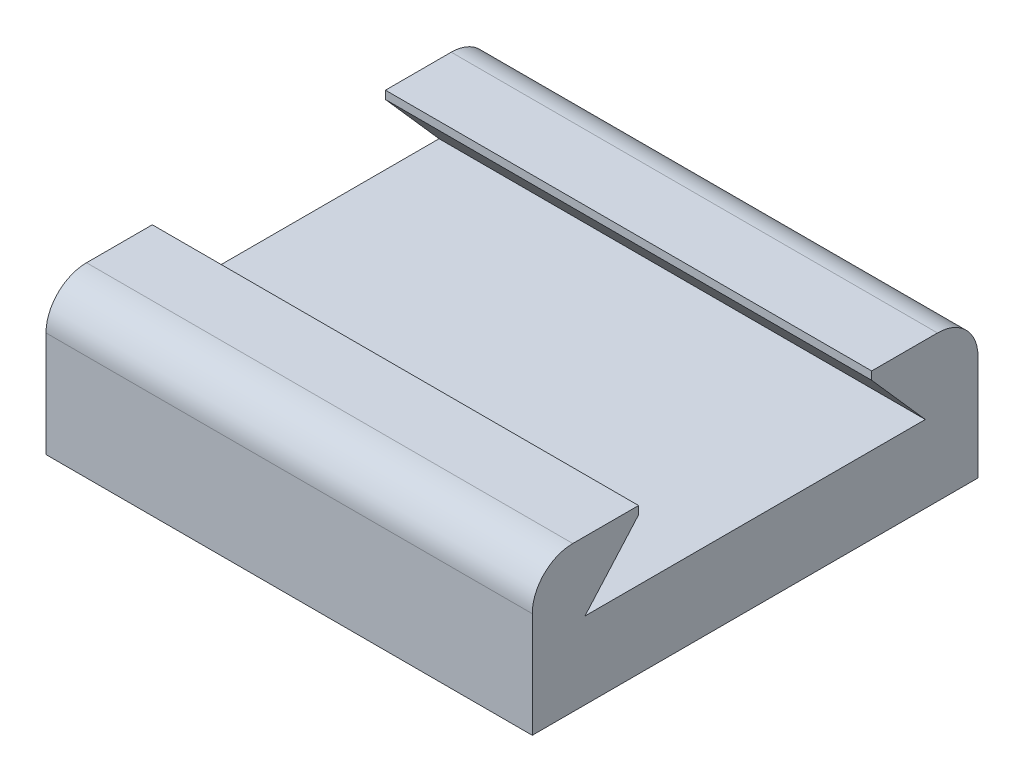
ISO-10303-21;
HEADER;
FILE_DESCRIPTION(('STEP AP214'),'2;1');
FILE_NAME('part.step','',(''),(''),'','','');
FILE_SCHEMA(('AUTOMOTIVE_DESIGN { 1 0 10303 214 1 1 1 1 }'));
ENDSEC;
DATA;
#1=APPLICATION_CONTEXT('core data for automotive mechanical design processes');
#2=APPLICATION_PROTOCOL_DEFINITION('international standard','automotive_design',2000,#1);
#3=PRODUCT_CONTEXT('',#1,'mechanical');
#4=PRODUCT('Part','Part','',(#3));
#5=PRODUCT_RELATED_PRODUCT_CATEGORY('part','',(#4));
#6=PRODUCT_DEFINITION_FORMATION('','',#4);
#7=PRODUCT_DEFINITION_CONTEXT('part definition',#1,'design');
#8=PRODUCT_DEFINITION('design','',#6,#7);
#9=PRODUCT_DEFINITION_SHAPE('','',#8);
#10=(LENGTH_UNIT() NAMED_UNIT(*) SI_UNIT(.MILLI.,.METRE.));
#11=(NAMED_UNIT(*) PLANE_ANGLE_UNIT() SI_UNIT($,.RADIAN.));
#12=(NAMED_UNIT(*) SI_UNIT($,.STERADIAN.) SOLID_ANGLE_UNIT());
#13=UNCERTAINTY_MEASURE_WITH_UNIT(LENGTH_MEASURE(1.E-05),#10,'distance_accuracy_value','');
#14=(GEOMETRIC_REPRESENTATION_CONTEXT(3) GLOBAL_UNCERTAINTY_ASSIGNED_CONTEXT((#13)) GLOBAL_UNIT_ASSIGNED_CONTEXT((#10,
#11,#12)) REPRESENTATION_CONTEXT('',''));
#15=CARTESIAN_POINT('',(0.,0.,0.));
#16=DIRECTION('',(0.,0.,1.));
#17=DIRECTION('',(1.,0.,0.));
#18=AXIS2_PLACEMENT_3D('',#15,#16,#17);
#19=CARTESIAN_POINT('',(0.,3.6,0.));
#20=DIRECTION('',(0.,-1.,0.));
#21=DIRECTION('',(0.,0.,-1.));
#22=AXIS2_PLACEMENT_3D('',#19,#20,#21);
#23=PLANE('',#22);
#24=DIRECTION('',(0.,0.,-1.));
#25=VECTOR('',#24,1.);
#26=CARTESIAN_POINT('',(12.,3.6,11.));
#27=LINE('',#26,#25);
#28=CARTESIAN_POINT('',(12.,3.6,2.6235294117647));
#29=VERTEX_POINT('',#28);
#30=CARTESIAN_POINT('',(12.,3.6,1.));
#31=VERTEX_POINT('',#30);
#32=EDGE_CURVE('E131',#29,#31,#27,.T.);
#33=ORIENTED_EDGE('',*,*,#32,.T.);
#34=DIRECTION('',(-1.,0.,0.));
#35=VECTOR('',#34,1.);
#36=CARTESIAN_POINT('',(0.,3.6,1.));
#37=LINE('',#36,#35);
#38=CARTESIAN_POINT('',(0.,3.6,1.));
#39=VERTEX_POINT('',#38);
#40=EDGE_CURVE('E128',#31,#39,#37,.T.);
#41=ORIENTED_EDGE('',*,*,#40,.T.);
#42=DIRECTION('',(0.,0.,1.));
#43=VECTOR('',#42,1.);
#44=CARTESIAN_POINT('',(0.,3.6,11.));
#45=LINE('',#44,#43);
#46=CARTESIAN_POINT('',(0.,3.6,2.62352941176471));
#47=VERTEX_POINT('',#46);
#48=EDGE_CURVE('E122',#39,#47,#45,.T.);
#49=ORIENTED_EDGE('',*,*,#48,.T.);
#50=DIRECTION('',(1.,0.,0.));
#51=VECTOR('',#50,1.);
#52=CARTESIAN_POINT('',(0.,3.6,2.62352941176471));
#53=LINE('',#52,#51);
#54=EDGE_CURVE('E125',#47,#29,#53,.T.);
#55=ORIENTED_EDGE('',*,*,#54,.T.);
#56=EDGE_LOOP('',(#33,#41,#49,#55));
#57=FACE_BOUND('',#56,.T.);
#58=ADVANCED_FACE('F33',(#57),#23,.F.);
#59=CARTESIAN_POINT('',(0.,1.6,0.));
#60=DIRECTION('',(1.,0.,0.));
#61=DIRECTION('',(0.,0.,-1.));
#62=AXIS2_PLACEMENT_3D('',#59,#60,#61);
#63=PLANE('',#62);
#64=ORIENTED_EDGE('',*,*,#48,.F.);
#65=CARTESIAN_POINT('',(0.,2.6,1.));
#66=DIRECTION('',(1.,0.,0.));
#67=DIRECTION('',(0.,0.,-1.));
#68=AXIS2_PLACEMENT_3D('',#65,#66,#67);
#69=CIRCLE('',#68,1.);
#70=CARTESIAN_POINT('',(0.,2.6,0.));
#71=VERTEX_POINT('',#70);
#72=EDGE_CURVE('E205',#39,#71,#69,.F.);
#73=ORIENTED_EDGE('',*,*,#72,.T.);
#74=DIRECTION('',(0.,-1.,0.));
#75=VECTOR('',#74,1.);
#76=CARTESIAN_POINT('',(0.,1.6,0.));
#77=LINE('',#76,#75);
#78=CARTESIAN_POINT('',(0.,0.,0.));
#79=VERTEX_POINT('',#78);
#80=EDGE_CURVE('E194',#71,#79,#77,.T.);
#81=ORIENTED_EDGE('',*,*,#80,.T.);
#82=DIRECTION('',(0.,0.,1.));
#83=VECTOR('',#82,1.);
#84=CARTESIAN_POINT('',(0.,0.,0.));
#85=LINE('',#84,#83);
#86=CARTESIAN_POINT('',(0.,0.,11.));
#87=VERTEX_POINT('',#86);
#88=EDGE_CURVE('E182',#79,#87,#85,.T.);
#89=ORIENTED_EDGE('',*,*,#88,.T.);
#90=DIRECTION('',(0.,-1.,0.));
#91=VECTOR('',#90,1.);
#92=CARTESIAN_POINT('',(0.,1.6,11.));
#93=LINE('',#92,#91);
#94=CARTESIAN_POINT('',(0.,2.6,11.));
#95=VERTEX_POINT('',#94);
#96=EDGE_CURVE('E200',#95,#87,#93,.T.);
#97=ORIENTED_EDGE('',*,*,#96,.F.);
#98=CARTESIAN_POINT('',(0.,2.6,10.));
#99=DIRECTION('',(1.,0.,0.));
#100=DIRECTION('',(0.,0.,-1.));
#101=AXIS2_PLACEMENT_3D('',#98,#99,#100);
#102=CIRCLE('',#101,1.);
#103=CARTESIAN_POINT('',(0.,3.6,10.));
#104=VERTEX_POINT('',#103);
#105=EDGE_CURVE('E203',#95,#104,#102,.F.);
#106=ORIENTED_EDGE('',*,*,#105,.T.);
#107=CARTESIAN_POINT('',(0.,3.6,8.3764705882353));
#108=VERTEX_POINT('',#107);
#109=EDGE_CURVE('E132',#108,#104,#45,.T.);
#110=ORIENTED_EDGE('',*,*,#109,.F.);
#111=DIRECTION('',(0.,-1.,0.));
#112=VECTOR('',#111,1.);
#113=CARTESIAN_POINT('',(0.,3.4,8.3764705882353));
#114=LINE('',#113,#112);
#115=CARTESIAN_POINT('',(0.,3.4,8.3764705882353));
#116=VERTEX_POINT('',#115);
#117=EDGE_CURVE('E152',#108,#116,#114,.T.);
#118=ORIENTED_EDGE('',*,*,#117,.T.);
#119=DIRECTION('',(0.,-0.749837855365092,0.661621637086847));
#120=VECTOR('',#119,1.);
#121=CARTESIAN_POINT('',(0.,1.9,9.7));
#122=LINE('',#121,#120);
#123=CARTESIAN_POINT('',(0.,1.9,9.7));
#124=VERTEX_POINT('',#123);
#125=EDGE_CURVE('E163',#116,#124,#122,.T.);
#126=ORIENTED_EDGE('',*,*,#125,.T.);
#127=DIRECTION('',(0.,0.,-1.));
#128=VECTOR('',#127,1.);
#129=CARTESIAN_POINT('',(0.,1.9,9.7));
#130=LINE('',#129,#128);
#131=CARTESIAN_POINT('',(0.,1.9,1.3));
#132=VERTEX_POINT('',#131);
#133=EDGE_CURVE('E165',#124,#132,#130,.T.);
#134=ORIENTED_EDGE('',*,*,#133,.T.);
#135=DIRECTION('',(0.,0.749837855365093,0.661621637086846));
#136=VECTOR('',#135,1.);
#137=CARTESIAN_POINT('',(0.,3.6,2.8));
#138=LINE('',#137,#136);
#139=CARTESIAN_POINT('',(0.,3.4,2.62352941176471));
#140=VERTEX_POINT('',#139);
#141=EDGE_CURVE('E147',#132,#140,#138,.T.);
#142=ORIENTED_EDGE('',*,*,#141,.T.);
#143=DIRECTION('',(0.,1.,0.));
#144=VECTOR('',#143,1.);
#145=CARTESIAN_POINT('',(0.,3.4,2.62352941176471));
#146=LINE('',#145,#144);
#147=EDGE_CURVE('E136',#140,#47,#146,.T.);
#148=ORIENTED_EDGE('',*,*,#147,.T.);
#149=EDGE_LOOP('',(#64,#73,#81,#89,#97,#106,#110,#118,#126,#134,#142,#148));
#150=FACE_BOUND('',#149,.T.);
#151=ADVANCED_FACE('F144',(#150),#63,.F.);
#152=CARTESIAN_POINT('',(0.,1.6,11.));
#153=DIRECTION('',(0.,0.,-1.));
#154=DIRECTION('',(-1.,0.,0.));
#155=AXIS2_PLACEMENT_3D('',#152,#153,#154);
#156=PLANE('',#155);
#157=DIRECTION('',(0.,-1.,0.));
#158=VECTOR('',#157,1.);
#159=CARTESIAN_POINT('',(12.,1.6,11.));
#160=LINE('',#159,#158);
#161=CARTESIAN_POINT('',(12.,2.6,11.));
#162=VERTEX_POINT('',#161);
#163=CARTESIAN_POINT('',(12.,0.,11.));
#164=VERTEX_POINT('',#163);
#165=EDGE_CURVE('E198',#162,#164,#160,.T.);
#166=ORIENTED_EDGE('',*,*,#165,.F.);
#167=DIRECTION('',(1.,0.,0.));
#168=VECTOR('',#167,1.);
#169=CARTESIAN_POINT('',(0.,2.6,11.));
#170=LINE('',#169,#168);
#171=EDGE_CURVE('E11',#162,#95,#170,.F.);
#172=ORIENTED_EDGE('',*,*,#171,.T.);
#173=ORIENTED_EDGE('',*,*,#96,.T.);
#174=DIRECTION('',(1.,0.,0.));
#175=VECTOR('',#174,1.);
#176=CARTESIAN_POINT('',(0.,0.,11.));
#177=LINE('',#176,#175);
#178=EDGE_CURVE('E185',#87,#164,#177,.T.);
#179=ORIENTED_EDGE('',*,*,#178,.T.);
#180=EDGE_LOOP('',(#166,#172,#173,#179));
#181=FACE_BOUND('',#180,.T.);
#182=ADVANCED_FACE('F231',(#181),#156,.F.);
#183=CARTESIAN_POINT('',(12.,1.6,0.));
#184=DIRECTION('',(-1.,0.,0.));
#185=DIRECTION('',(0.,0.,1.));
#186=AXIS2_PLACEMENT_3D('',#183,#184,#185);
#187=PLANE('',#186);
#188=DIRECTION('',(0.,-1.,0.));
#189=VECTOR('',#188,1.);
#190=CARTESIAN_POINT('',(12.,1.6,0.));
#191=LINE('',#190,#189);
#192=CARTESIAN_POINT('',(12.,2.6,0.));
#193=VERTEX_POINT('',#192);
#194=CARTESIAN_POINT('',(12.,0.,0.));
#195=VERTEX_POINT('',#194);
#196=EDGE_CURVE('E196',#193,#195,#191,.T.);
#197=ORIENTED_EDGE('',*,*,#196,.F.);
#198=CARTESIAN_POINT('',(12.,2.6,1.));
#199=DIRECTION('',(-1.,0.,0.));
#200=DIRECTION('',(0.,0.,1.));
#201=AXIS2_PLACEMENT_3D('',#198,#199,#200);
#202=CIRCLE('',#201,1.);
#203=EDGE_CURVE('E210',#193,#31,#202,.F.);
#204=ORIENTED_EDGE('',*,*,#203,.T.);
#205=ORIENTED_EDGE('',*,*,#32,.F.);
#206=DIRECTION('',(0.,1.,0.));
#207=VECTOR('',#206,1.);
#208=CARTESIAN_POINT('',(12.,3.4,2.6235294117647));
#209=LINE('',#208,#207);
#210=CARTESIAN_POINT('',(12.,3.4,2.6235294117647));
#211=VERTEX_POINT('',#210);
#212=EDGE_CURVE('E139',#211,#29,#209,.T.);
#213=ORIENTED_EDGE('',*,*,#212,.F.);
#214=DIRECTION('',(0.,0.749837855365093,0.661621637086846));
#215=VECTOR('',#214,1.);
#216=CARTESIAN_POINT('',(12.,3.6,2.8));
#217=LINE('',#216,#215);
#218=CARTESIAN_POINT('',(12.,1.9,1.3));
#219=VERTEX_POINT('',#218);
#220=EDGE_CURVE('E166',#219,#211,#217,.T.);
#221=ORIENTED_EDGE('',*,*,#220,.F.);
#222=DIRECTION('',(0.,0.,-1.));
#223=VECTOR('',#222,1.);
#224=CARTESIAN_POINT('',(12.,1.9,9.7));
#225=LINE('',#224,#223);
#226=CARTESIAN_POINT('',(12.,1.9,9.7));
#227=VERTEX_POINT('',#226);
#228=EDGE_CURVE('E171',#227,#219,#225,.T.);
#229=ORIENTED_EDGE('',*,*,#228,.F.);
#230=DIRECTION('',(0.,-0.749837855365092,0.661621637086847));
#231=VECTOR('',#230,1.);
#232=CARTESIAN_POINT('',(12.,1.9,9.7));
#233=LINE('',#232,#231);
#234=CARTESIAN_POINT('',(12.,3.4,8.37647058823529));
#235=VERTEX_POINT('',#234);
#236=EDGE_CURVE('E160',#235,#227,#233,.T.);
#237=ORIENTED_EDGE('',*,*,#236,.F.);
#238=DIRECTION('',(0.,-1.,0.));
#239=VECTOR('',#238,1.);
#240=CARTESIAN_POINT('',(12.,3.4,8.37647058823529));
#241=LINE('',#240,#239);
#242=CARTESIAN_POINT('',(12.,3.6,8.37647058823529));
#243=VERTEX_POINT('',#242);
#244=EDGE_CURVE('E140',#243,#235,#241,.T.);
#245=ORIENTED_EDGE('',*,*,#244,.F.);
#246=CARTESIAN_POINT('',(12.,3.6,10.));
#247=VERTEX_POINT('',#246);
#248=EDGE_CURVE('E180',#247,#243,#27,.T.);
#249=ORIENTED_EDGE('',*,*,#248,.F.);
#250=CARTESIAN_POINT('',(12.,2.6,10.));
#251=DIRECTION('',(-1.,0.,0.));
#252=DIRECTION('',(0.,0.,1.));
#253=AXIS2_PLACEMENT_3D('',#250,#251,#252);
#254=CIRCLE('',#253,1.);
#255=EDGE_CURVE('E48',#247,#162,#254,.F.);
#256=ORIENTED_EDGE('',*,*,#255,.T.);
#257=ORIENTED_EDGE('',*,*,#165,.T.);
#258=DIRECTION('',(0.,0.,-1.));
#259=VECTOR('',#258,1.);
#260=CARTESIAN_POINT('',(12.,0.,0.));
#261=LINE('',#260,#259);
#262=EDGE_CURVE('E188',#164,#195,#261,.T.);
#263=ORIENTED_EDGE('',*,*,#262,.T.);
#264=EDGE_LOOP('',(#197,#204,#205,#213,#221,#229,#237,#245,#249,#256,#257,#263));
#265=FACE_BOUND('',#264,.T.);
#266=ADVANCED_FACE('F219',(#265),#187,.F.);
#267=CARTESIAN_POINT('',(0.,1.6,0.));
#268=DIRECTION('',(0.,0.,1.));
#269=DIRECTION('',(1.,0.,0.));
#270=AXIS2_PLACEMENT_3D('',#267,#268,#269);
#271=PLANE('',#270);
#272=ORIENTED_EDGE('',*,*,#80,.F.);
#273=DIRECTION('',(-1.,0.,0.));
#274=VECTOR('',#273,1.);
#275=CARTESIAN_POINT('',(0.,2.6,0.));
#276=LINE('',#275,#274);
#277=EDGE_CURVE('E207',#71,#193,#276,.F.);
#278=ORIENTED_EDGE('',*,*,#277,.T.);
#279=ORIENTED_EDGE('',*,*,#196,.T.);
#280=DIRECTION('',(-1.,0.,0.));
#281=VECTOR('',#280,1.);
#282=CARTESIAN_POINT('',(0.,0.,0.));
#283=LINE('',#282,#281);
#284=EDGE_CURVE('E191',#195,#79,#283,.T.);
#285=ORIENTED_EDGE('',*,*,#284,.T.);
#286=EDGE_LOOP('',(#272,#278,#279,#285));
#287=FACE_BOUND('',#286,.T.);
#288=ADVANCED_FACE('F241',(#287),#271,.F.);
#289=CARTESIAN_POINT('',(0.,0.,0.));
#290=DIRECTION('',(0.,1.,0.));
#291=DIRECTION('',(0.,0.,1.));
#292=AXIS2_PLACEMENT_3D('',#289,#290,#291);
#293=PLANE('',#292);
#294=ORIENTED_EDGE('',*,*,#88,.F.);
#295=ORIENTED_EDGE('',*,*,#284,.F.);
#296=ORIENTED_EDGE('',*,*,#262,.F.);
#297=ORIENTED_EDGE('',*,*,#178,.F.);
#298=EDGE_LOOP('',(#294,#295,#296,#297));
#299=FACE_BOUND('',#298,.T.);
#300=ADVANCED_FACE('F238',(#299),#293,.F.);
#301=ORIENTED_EDGE('',*,*,#109,.T.);
#302=DIRECTION('',(1.,0.,0.));
#303=VECTOR('',#302,1.);
#304=CARTESIAN_POINT('',(0.,3.6,10.));
#305=LINE('',#304,#303);
#306=EDGE_CURVE('E41',#104,#247,#305,.T.);
#307=ORIENTED_EDGE('',*,*,#306,.T.);
#308=ORIENTED_EDGE('',*,*,#248,.T.);
#309=DIRECTION('',(1.,0.,0.));
#310=VECTOR('',#309,1.);
#311=CARTESIAN_POINT('',(0.,3.6,8.3764705882353));
#312=LINE('',#311,#310);
#313=EDGE_CURVE('E155',#108,#243,#312,.T.);
#314=ORIENTED_EDGE('',*,*,#313,.F.);
#315=EDGE_LOOP('',(#301,#307,#308,#314));
#316=FACE_BOUND('',#315,.T.);
#317=ADVANCED_FACE('F213',(#316),#23,.F.);
#318=CARTESIAN_POINT('',(0.,3.6,2.8));
#319=DIRECTION('',(0.,0.661621637086846,-0.749837855365093));
#320=DIRECTION('',(0.,0.749837855365093,0.661621637086846));
#321=AXIS2_PLACEMENT_3D('',#318,#319,#320);
#322=PLANE('',#321);
#323=ORIENTED_EDGE('',*,*,#220,.T.);
#324=DIRECTION('',(1.,0.,0.));
#325=VECTOR('',#324,1.);
#326=CARTESIAN_POINT('',(0.,3.4,2.62352941176471));
#327=LINE('',#326,#325);
#328=EDGE_CURVE('E141',#140,#211,#327,.T.);
#329=ORIENTED_EDGE('',*,*,#328,.F.);
#330=ORIENTED_EDGE('',*,*,#141,.F.);
#331=DIRECTION('',(1.,0.,0.));
#332=VECTOR('',#331,1.);
#333=CARTESIAN_POINT('',(0.,1.9,1.3));
#334=LINE('',#333,#332);
#335=EDGE_CURVE('E176',#132,#219,#334,.T.);
#336=ORIENTED_EDGE('',*,*,#335,.T.);
#337=EDGE_LOOP('',(#323,#329,#330,#336));
#338=FACE_BOUND('',#337,.T.);
#339=ADVANCED_FACE('F247',(#338),#322,.F.);
#340=CARTESIAN_POINT('',(0.,1.9,9.7));
#341=DIRECTION('',(0.,-1.,0.));
#342=DIRECTION('',(0.,0.,-1.));
#343=AXIS2_PLACEMENT_3D('',#340,#341,#342);
#344=PLANE('',#343);
#345=ORIENTED_EDGE('',*,*,#228,.T.);
#346=ORIENTED_EDGE('',*,*,#335,.F.);
#347=ORIENTED_EDGE('',*,*,#133,.F.);
#348=DIRECTION('',(1.,0.,0.));
#349=VECTOR('',#348,1.);
#350=CARTESIAN_POINT('',(0.,1.9,9.7));
#351=LINE('',#350,#349);
#352=EDGE_CURVE('E169',#124,#227,#351,.T.);
#353=ORIENTED_EDGE('',*,*,#352,.T.);
#354=EDGE_LOOP('',(#345,#346,#347,#353));
#355=FACE_BOUND('',#354,.T.);
#356=ADVANCED_FACE('F249',(#355),#344,.F.);
#357=CARTESIAN_POINT('',(0.,1.9,9.7));
#358=DIRECTION('',(0.,0.661621637086847,0.749837855365092));
#359=DIRECTION('',(0.,-0.749837855365092,0.661621637086847));
#360=AXIS2_PLACEMENT_3D('',#357,#358,#359);
#361=PLANE('',#360);
#362=ORIENTED_EDGE('',*,*,#125,.F.);
#363=DIRECTION('',(1.,0.,0.));
#364=VECTOR('',#363,1.);
#365=CARTESIAN_POINT('',(0.,3.4,8.3764705882353));
#366=LINE('',#365,#364);
#367=EDGE_CURVE('E157',#116,#235,#366,.T.);
#368=ORIENTED_EDGE('',*,*,#367,.T.);
#369=ORIENTED_EDGE('',*,*,#236,.T.);
#370=ORIENTED_EDGE('',*,*,#352,.F.);
#371=EDGE_LOOP('',(#362,#368,#369,#370));
#372=FACE_BOUND('',#371,.T.);
#373=ADVANCED_FACE('F226',(#372),#361,.F.);
#374=CARTESIAN_POINT('',(0.,3.4,8.3764705882353));
#375=DIRECTION('',(0.,0.,1.));
#376=DIRECTION('',(1.,0.,0.));
#377=AXIS2_PLACEMENT_3D('',#374,#375,#376);
#378=PLANE('',#377);
#379=ORIENTED_EDGE('',*,*,#244,.T.);
#380=ORIENTED_EDGE('',*,*,#367,.F.);
#381=ORIENTED_EDGE('',*,*,#117,.F.);
#382=ORIENTED_EDGE('',*,*,#313,.T.);
#383=EDGE_LOOP('',(#379,#380,#381,#382));
#384=FACE_BOUND('',#383,.T.);
#385=ADVANCED_FACE('F223',(#384),#378,.F.);
#386=CARTESIAN_POINT('',(0.,3.4,2.62352941176471));
#387=DIRECTION('',(0.,0.,-1.));
#388=DIRECTION('',(-1.,0.,0.));
#389=AXIS2_PLACEMENT_3D('',#386,#387,#388);
#390=PLANE('',#389);
#391=ORIENTED_EDGE('',*,*,#212,.T.);
#392=ORIENTED_EDGE('',*,*,#54,.F.);
#393=ORIENTED_EDGE('',*,*,#147,.F.);
#394=ORIENTED_EDGE('',*,*,#328,.T.);
#395=EDGE_LOOP('',(#391,#392,#393,#394));
#396=FACE_BOUND('',#395,.T.);
#397=ADVANCED_FACE('F135',(#396),#390,.F.);
#398=CARTESIAN_POINT('',(0.,2.6,1.));
#399=DIRECTION('',(-1.,0.,0.));
#400=DIRECTION('',(0.,0.,1.));
#401=AXIS2_PLACEMENT_3D('',#398,#399,#400);
#402=CYLINDRICAL_SURFACE('',#401,1.);
#403=ORIENTED_EDGE('',*,*,#203,.F.);
#404=ORIENTED_EDGE('',*,*,#277,.F.);
#405=ORIENTED_EDGE('',*,*,#72,.F.);
#406=ORIENTED_EDGE('',*,*,#40,.F.);
#407=EDGE_LOOP('',(#403,#404,#405,#406));
#408=FACE_BOUND('',#407,.T.);
#409=ADVANCED_FACE('F244',(#408),#402,.T.);
#410=CARTESIAN_POINT('',(0.,2.6,10.));
#411=DIRECTION('',(1.,0.,0.));
#412=DIRECTION('',(0.,0.,-1.));
#413=AXIS2_PLACEMENT_3D('',#410,#411,#412);
#414=CYLINDRICAL_SURFACE('',#413,1.);
#415=ORIENTED_EDGE('',*,*,#105,.F.);
#416=ORIENTED_EDGE('',*,*,#171,.F.);
#417=ORIENTED_EDGE('',*,*,#255,.F.);
#418=ORIENTED_EDGE('',*,*,#306,.F.);
#419=EDGE_LOOP('',(#415,#416,#417,#418));
#420=FACE_BOUND('',#419,.T.);
#421=ADVANCED_FACE('F35',(#420),#414,.T.);
#422=CLOSED_SHELL('',(#58,#151,#182,#266,#288,#300,#317,#339,#356,#373,#385,#397,#409,#421));
#423=MANIFOLD_SOLID_BREP('B2',#422);
#424=ADVANCED_BREP_SHAPE_REPRESENTATION('',(#18,#423),#14);
#425=SHAPE_DEFINITION_REPRESENTATION(#9,#424);
ENDSEC;
END-ISO-10303-21;
